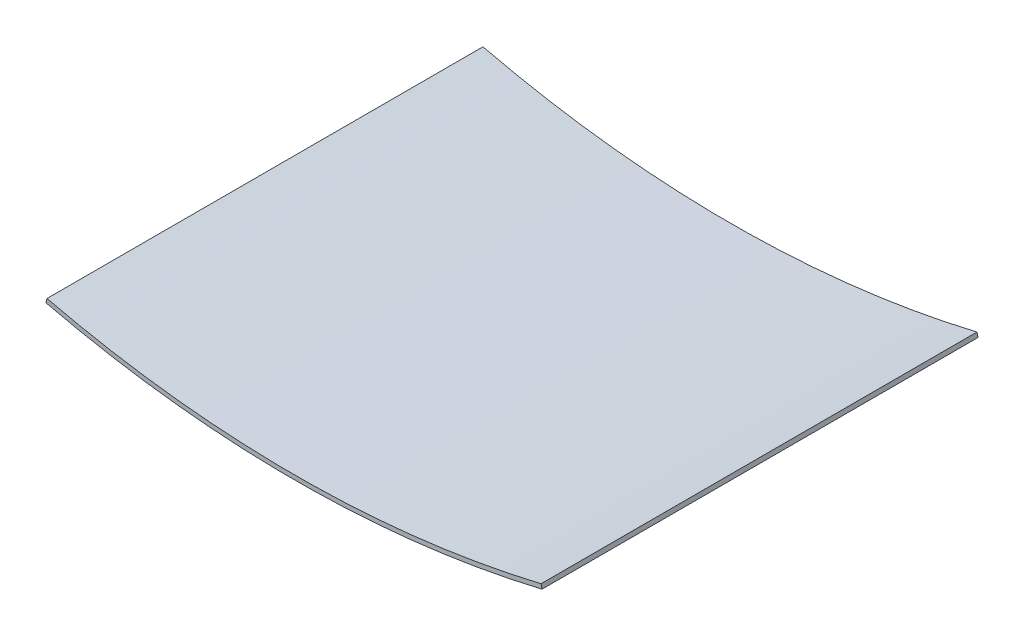
ISO-10303-21;
HEADER;
FILE_DESCRIPTION(('STEP AP214'),'2;1');
FILE_NAME('part.step','',(''),(''),'','','');
FILE_SCHEMA(('AUTOMOTIVE_DESIGN { 1 0 10303 214 1 1 1 1 }'));
ENDSEC;
DATA;
#1=APPLICATION_CONTEXT('core data for automotive mechanical design processes');
#2=APPLICATION_PROTOCOL_DEFINITION('international standard','automotive_design',2000,#1);
#3=PRODUCT_CONTEXT('',#1,'mechanical');
#4=PRODUCT('Part','Part','',(#3));
#5=PRODUCT_RELATED_PRODUCT_CATEGORY('part','',(#4));
#6=PRODUCT_DEFINITION_FORMATION('','',#4);
#7=PRODUCT_DEFINITION_CONTEXT('part definition',#1,'design');
#8=PRODUCT_DEFINITION('design','',#6,#7);
#9=PRODUCT_DEFINITION_SHAPE('','',#8);
#10=(LENGTH_UNIT() NAMED_UNIT(*) SI_UNIT(.MILLI.,.METRE.));
#11=(NAMED_UNIT(*) PLANE_ANGLE_UNIT() SI_UNIT($,.RADIAN.));
#12=(NAMED_UNIT(*) SI_UNIT($,.STERADIAN.) SOLID_ANGLE_UNIT());
#13=UNCERTAINTY_MEASURE_WITH_UNIT(LENGTH_MEASURE(1.E-05),#10,'distance_accuracy_value','');
#14=(GEOMETRIC_REPRESENTATION_CONTEXT(3) GLOBAL_UNCERTAINTY_ASSIGNED_CONTEXT((#13)) GLOBAL_UNIT_ASSIGNED_CONTEXT((#10,
#11,#12)) REPRESENTATION_CONTEXT('',''));
#15=CARTESIAN_POINT('',(0.,0.,0.));
#16=DIRECTION('',(0.,0.,1.));
#17=DIRECTION('',(1.,0.,0.));
#18=AXIS2_PLACEMENT_3D('',#15,#16,#17);
#19=CARTESIAN_POINT('',(0.,930.275,381.));
#20=DIRECTION('',(0.,0.,-1.));
#21=DIRECTION('',(-1.,0.,0.));
#22=AXIS2_PLACEMENT_3D('',#19,#20,#21);
#23=CYLINDRICAL_SURFACE('',#22,934.085);
#24=CARTESIAN_POINT('',(0.,930.275,0.));
#25=DIRECTION('',(0.,0.,1.));
#26=DIRECTION('',(1.,0.,0.));
#27=AXIS2_PLACEMENT_3D('',#24,#25,#26);
#28=CIRCLE('',#27,934.085);
#29=CARTESIAN_POINT('',(-216.784232081911,21.6940273037542,0.));
#30=VERTEX_POINT('',#29);
#31=CARTESIAN_POINT('',(216.784232081911,21.6940273037541,0.));
#32=VERTEX_POINT('',#31);
#33=EDGE_CURVE('E103',#30,#32,#28,.T.);
#34=ORIENTED_EDGE('',*,*,#33,.T.);
#35=DIRECTION('',(0.,0.,-1.));
#36=VECTOR('',#35,1.);
#37=CARTESIAN_POINT('',(216.784232081911,21.6940273037541,381.));
#38=LINE('',#37,#36);
#39=CARTESIAN_POINT('',(216.784232081911,21.6940273037541,381.));
#40=VERTEX_POINT('',#39);
#41=EDGE_CURVE('E11',#40,#32,#38,.T.);
#42=ORIENTED_EDGE('',*,*,#41,.F.);
#43=CARTESIAN_POINT('',(0.,930.275,381.));
#44=DIRECTION('',(0.,0.,1.));
#45=DIRECTION('',(1.,0.,0.));
#46=AXIS2_PLACEMENT_3D('',#43,#44,#45);
#47=CIRCLE('',#46,934.085);
#48=CARTESIAN_POINT('',(-216.784232081911,21.6940273037542,381.));
#49=VERTEX_POINT('',#48);
#50=EDGE_CURVE('E80',#49,#40,#47,.T.);
#51=ORIENTED_EDGE('',*,*,#50,.F.);
#52=DIRECTION('',(0.,0.,-1.));
#53=VECTOR('',#52,1.);
#54=CARTESIAN_POINT('',(-216.784232081911,21.6940273037542,381.));
#55=LINE('',#54,#53);
#56=EDGE_CURVE('E56',#49,#30,#55,.T.);
#57=ORIENTED_EDGE('',*,*,#56,.T.);
#58=EDGE_LOOP('',(#34,#42,#51,#57));
#59=FACE_BOUND('',#58,.T.);
#60=ADVANCED_FACE('F40',(#59),#23,.T.);
#61=CARTESIAN_POINT('',(215.9,25.3999999999999,381.));
#62=DIRECTION('',(0.97269624573379,0.232081911262793,0.));
#63=DIRECTION('',(-0.232081911262793,0.97269624573379,0.));
#64=AXIS2_PLACEMENT_3D('',#61,#62,#63);
#65=PLANE('',#64);
#66=DIRECTION('',(0.232081911262793,-0.97269624573379,0.));
#67=VECTOR('',#66,1.);
#68=CARTESIAN_POINT('',(215.9,25.3999999999999,0.));
#69=LINE('',#68,#67);
#70=CARTESIAN_POINT('',(215.9,25.3999999999999,0.));
#71=VERTEX_POINT('',#70);
#72=EDGE_CURVE('E89',#71,#32,#69,.T.);
#73=ORIENTED_EDGE('',*,*,#72,.F.);
#74=DIRECTION('',(0.,0.,-1.));
#75=VECTOR('',#74,1.);
#76=CARTESIAN_POINT('',(215.9,25.3999999999999,381.));
#77=LINE('',#76,#75);
#78=CARTESIAN_POINT('',(215.9,25.3999999999999,381.));
#79=VERTEX_POINT('',#78);
#80=EDGE_CURVE('E48',#79,#71,#77,.T.);
#81=ORIENTED_EDGE('',*,*,#80,.F.);
#82=DIRECTION('',(0.232081911262793,-0.97269624573379,0.));
#83=VECTOR('',#82,1.);
#84=CARTESIAN_POINT('',(215.9,25.3999999999999,381.));
#85=LINE('',#84,#83);
#86=EDGE_CURVE('E87',#79,#40,#85,.T.);
#87=ORIENTED_EDGE('',*,*,#86,.T.);
#88=ORIENTED_EDGE('',*,*,#41,.T.);
#89=EDGE_LOOP('',(#73,#81,#87,#88));
#90=FACE_BOUND('',#89,.T.);
#91=ADVANCED_FACE('F86',(#90),#65,.T.);
#92=CARTESIAN_POINT('',(0.,930.275,381.));
#93=DIRECTION('',(0.,0.,-1.));
#94=DIRECTION('',(-1.,0.,0.));
#95=AXIS2_PLACEMENT_3D('',#92,#93,#94);
#96=CYLINDRICAL_SURFACE('',#95,930.275);
#97=CARTESIAN_POINT('',(0.,930.275,0.));
#98=DIRECTION('',(0.,0.,1.));
#99=DIRECTION('',(1.,0.,0.));
#100=AXIS2_PLACEMENT_3D('',#97,#98,#99);
#101=CIRCLE('',#100,930.275);
#102=CARTESIAN_POINT('',(-215.9,25.4,0.));
#103=VERTEX_POINT('',#102);
#104=EDGE_CURVE('E106',#103,#71,#101,.T.);
#105=ORIENTED_EDGE('',*,*,#104,.F.);
#106=DIRECTION('',(0.,0.,-1.));
#107=VECTOR('',#106,1.);
#108=CARTESIAN_POINT('',(-215.9,25.4,381.));
#109=LINE('',#108,#107);
#110=CARTESIAN_POINT('',(-215.9,25.4,381.));
#111=VERTEX_POINT('',#110);
#112=EDGE_CURVE('E69',#111,#103,#109,.T.);
#113=ORIENTED_EDGE('',*,*,#112,.F.);
#114=CARTESIAN_POINT('',(0.,930.275,381.));
#115=DIRECTION('',(0.,0.,1.));
#116=DIRECTION('',(1.,0.,0.));
#117=AXIS2_PLACEMENT_3D('',#114,#115,#116);
#118=CIRCLE('',#117,930.275);
#119=EDGE_CURVE('E95',#111,#79,#118,.T.);
#120=ORIENTED_EDGE('',*,*,#119,.T.);
#121=ORIENTED_EDGE('',*,*,#80,.T.);
#122=EDGE_LOOP('',(#105,#113,#120,#121));
#123=FACE_BOUND('',#122,.T.);
#124=ADVANCED_FACE('F97',(#123),#96,.F.);
#125=CARTESIAN_POINT('',(-216.784232081911,21.6940273037542,381.));
#126=DIRECTION('',(-0.97269624573379,0.232081911262793,0.));
#127=DIRECTION('',(-0.232081911262793,-0.97269624573379,0.));
#128=AXIS2_PLACEMENT_3D('',#125,#126,#127);
#129=PLANE('',#128);
#130=DIRECTION('',(0.232081911262793,0.97269624573379,0.));
#131=VECTOR('',#130,1.);
#132=CARTESIAN_POINT('',(-216.784232081911,21.6940273037542,0.));
#133=LINE('',#132,#131);
#134=EDGE_CURVE('E108',#30,#103,#133,.T.);
#135=ORIENTED_EDGE('',*,*,#134,.F.);
#136=ORIENTED_EDGE('',*,*,#56,.F.);
#137=DIRECTION('',(0.232081911262793,0.97269624573379,0.));
#138=VECTOR('',#137,1.);
#139=CARTESIAN_POINT('',(-216.784232081911,21.6940273037542,381.));
#140=LINE('',#139,#138);
#141=EDGE_CURVE('E98',#49,#111,#140,.T.);
#142=ORIENTED_EDGE('',*,*,#141,.T.);
#143=ORIENTED_EDGE('',*,*,#112,.T.);
#144=EDGE_LOOP('',(#135,#136,#142,#143));
#145=FACE_BOUND('',#144,.T.);
#146=ADVANCED_FACE('F114',(#145),#129,.T.);
#147=CARTESIAN_POINT('',(0.,930.275,381.));
#148=DIRECTION('',(0.,0.,1.));
#149=DIRECTION('',(1.,0.,0.));
#150=AXIS2_PLACEMENT_3D('',#147,#148,#149);
#151=PLANE('',#150);
#152=ORIENTED_EDGE('',*,*,#50,.T.);
#153=ORIENTED_EDGE('',*,*,#86,.F.);
#154=ORIENTED_EDGE('',*,*,#119,.F.);
#155=ORIENTED_EDGE('',*,*,#141,.F.);
#156=EDGE_LOOP('',(#152,#153,#154,#155));
#157=FACE_BOUND('',#156,.T.);
#158=ADVANCED_FACE('F94',(#157),#151,.T.);
#159=CARTESIAN_POINT('',(0.,930.275,0.));
#160=DIRECTION('',(0.,0.,1.));
#161=DIRECTION('',(1.,0.,0.));
#162=AXIS2_PLACEMENT_3D('',#159,#160,#161);
#163=PLANE('',#162);
#164=ORIENTED_EDGE('',*,*,#33,.F.);
#165=ORIENTED_EDGE('',*,*,#134,.T.);
#166=ORIENTED_EDGE('',*,*,#104,.T.);
#167=ORIENTED_EDGE('',*,*,#72,.T.);
#168=EDGE_LOOP('',(#164,#165,#166,#167));
#169=FACE_BOUND('',#168,.T.);
#170=ADVANCED_FACE('F113',(#169),#163,.F.);
#171=CLOSED_SHELL('',(#60,#91,#124,#146,#158,#170));
#172=MANIFOLD_SOLID_BREP('B2',#171);
#173=ADVANCED_BREP_SHAPE_REPRESENTATION('',(#18,#172),#14);
#174=SHAPE_DEFINITION_REPRESENTATION(#9,#173);
ENDSEC;
END-ISO-10303-21;
